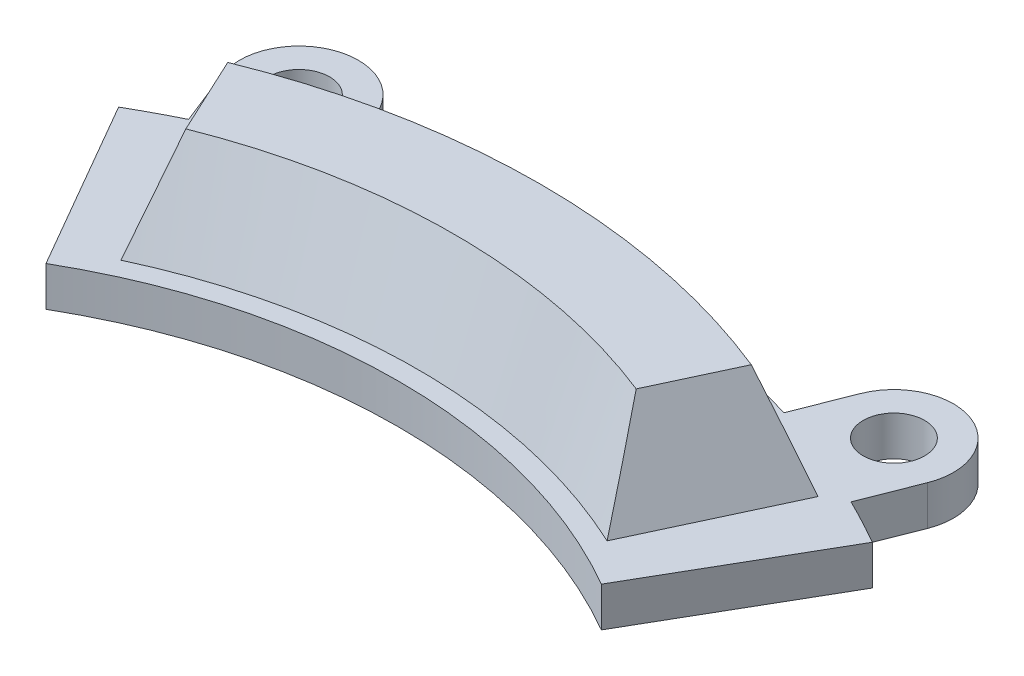
ISO-10303-21;
HEADER;
FILE_DESCRIPTION(('STEP AP214'),'2;1');
FILE_NAME('part.step','',(''),(''),'','','');
FILE_SCHEMA(('AUTOMOTIVE_DESIGN { 1 0 10303 214 1 1 1 1 }'));
ENDSEC;
DATA;
#1=APPLICATION_CONTEXT('core data for automotive mechanical design processes');
#2=APPLICATION_PROTOCOL_DEFINITION('international standard','automotive_design',2000,#1);
#3=PRODUCT_CONTEXT('',#1,'mechanical');
#4=PRODUCT('Part','Part','',(#3));
#5=PRODUCT_RELATED_PRODUCT_CATEGORY('part','',(#4));
#6=PRODUCT_DEFINITION_FORMATION('','',#4);
#7=PRODUCT_DEFINITION_CONTEXT('part definition',#1,'design');
#8=PRODUCT_DEFINITION('design','',#6,#7);
#9=PRODUCT_DEFINITION_SHAPE('','',#8);
#10=(LENGTH_UNIT() NAMED_UNIT(*) SI_UNIT(.MILLI.,.METRE.));
#11=(NAMED_UNIT(*) PLANE_ANGLE_UNIT() SI_UNIT($,.RADIAN.));
#12=(NAMED_UNIT(*) SI_UNIT($,.STERADIAN.) SOLID_ANGLE_UNIT());
#13=UNCERTAINTY_MEASURE_WITH_UNIT(LENGTH_MEASURE(1.E-05),#10,'distance_accuracy_value','');
#14=(GEOMETRIC_REPRESENTATION_CONTEXT(3) GLOBAL_UNCERTAINTY_ASSIGNED_CONTEXT((#13)) GLOBAL_UNIT_ASSIGNED_CONTEXT((#10,
#11,#12)) REPRESENTATION_CONTEXT('',''));
#15=CARTESIAN_POINT('',(0.,0.,0.));
#16=DIRECTION('',(0.,0.,1.));
#17=DIRECTION('',(1.,0.,0.));
#18=AXIS2_PLACEMENT_3D('',#15,#16,#17);
#19=CARTESIAN_POINT('',(0.,2.,0.));
#20=DIRECTION('',(0.,1.,0.));
#21=DIRECTION('',(0.,0.,1.));
#22=AXIS2_PLACEMENT_3D('',#19,#20,#21);
#23=PLANE('',#22);
#24=CARTESIAN_POINT('',(15.,2.,-38.));
#25=DIRECTION('',(0.,1.,0.));
#26=DIRECTION('',(0.,0.,1.));
#27=AXIS2_PLACEMENT_3D('',#24,#25,#26);
#28=CIRCLE('',#27,1.55);
#29=CARTESIAN_POINT('',(15.,2.,-36.45));
#30=VERTEX_POINT('',#29);
#31=EDGE_CURVE('E181',#30,#30,#28,.T.);
#32=ORIENTED_EDGE('',*,*,#31,.F.);
#33=EDGE_LOOP('',(#32));
#34=FACE_BOUND('',#33,.T.);
#35=CARTESIAN_POINT('',(0.,2.,0.));
#36=DIRECTION('',(0.,1.,0.));
#37=DIRECTION('',(0.,0.,1.));
#38=AXIS2_PLACEMENT_3D('',#35,#36,#37);
#39=CIRCLE('',#38,38.);
#40=CARTESIAN_POINT('',(-16.6992457747787,2.,-34.1340766764466));
#41=VERTEX_POINT('',#40);
#42=CARTESIAN_POINT('',(-19.0000000000002,2.,-32.9089653438086));
#43=VERTEX_POINT('',#42);
#44=EDGE_CURVE('E212',#41,#43,#39,.T.);
#45=ORIENTED_EDGE('',*,*,#44,.T.);
#46=DIRECTION('',(0.500000000000004,0.,0.866025403784436));
#47=VECTOR('',#46,1.);
#48=CARTESIAN_POINT('',(-14.0000000000001,2.,-24.2487113059642));
#49=LINE('',#48,#47);
#50=CARTESIAN_POINT('',(-14.0000000000001,2.,-24.2487113059642));
#51=VERTEX_POINT('',#50);
#52=EDGE_CURVE('E117',#43,#51,#49,.T.);
#53=ORIENTED_EDGE('',*,*,#52,.T.);
#54=CARTESIAN_POINT('',(0.,2.,0.));
#55=DIRECTION('',(0.,-1.,0.));
#56=DIRECTION('',(0.,0.,1.));
#57=AXIS2_PLACEMENT_3D('',#54,#55,#56);
#58=CIRCLE('',#57,28.);
#59=CARTESIAN_POINT('',(13.9999999999999,2.,-24.2487113059643));
#60=VERTEX_POINT('',#59);
#61=EDGE_CURVE('E249',#51,#60,#58,.T.);
#62=ORIENTED_EDGE('',*,*,#61,.T.);
#63=DIRECTION('',(0.499999999999998,0.,-0.86602540378444));
#64=VECTOR('',#63,1.);
#65=CARTESIAN_POINT('',(13.9999999999999,2.,-24.2487113059643));
#66=LINE('',#65,#64);
#67=CARTESIAN_POINT('',(18.9999999999999,2.,-32.9089653438087));
#68=VERTEX_POINT('',#67);
#69=EDGE_CURVE('E269',#60,#68,#66,.T.);
#70=ORIENTED_EDGE('',*,*,#69,.T.);
#71=CARTESIAN_POINT('',(0.,2.,0.));
#72=DIRECTION('',(0.,1.,0.));
#73=DIRECTION('',(0.,0.,1.));
#74=AXIS2_PLACEMENT_3D('',#71,#72,#73);
#75=CIRCLE('',#74,38.);
#76=CARTESIAN_POINT('',(16.6992457747787,2.,-34.1340766764466));
#77=VERTEX_POINT('',#76);
#78=EDGE_CURVE('E265',#68,#77,#75,.T.);
#79=ORIENTED_EDGE('',*,*,#78,.T.);
#80=DIRECTION('',(0.367166534736049,0.,-0.930155221331322));
#81=VECTOR('',#80,1.);
#82=CARTESIAN_POINT('',(16.6992457747787,2.,-34.1340766764466));
#83=LINE('',#82,#81);
#84=CARTESIAN_POINT('',(17.790465663994,2.,-36.8985003957919));
#85=VERTEX_POINT('',#84);
#86=EDGE_CURVE('E268',#77,#85,#83,.T.);
#87=ORIENTED_EDGE('',*,*,#86,.T.);
#88=CARTESIAN_POINT('',(15.,2.,-38.));
#89=DIRECTION('',(0.,1.,0.));
#90=DIRECTION('',(0.,0.,1.));
#91=AXIS2_PLACEMENT_3D('',#88,#89,#90);
#92=CIRCLE('',#91,3.);
#93=CARTESIAN_POINT('',(12.209534336006,2.,-39.1014996042081));
#94=VERTEX_POINT('',#93);
#95=EDGE_CURVE('E273',#85,#94,#92,.T.);
#96=ORIENTED_EDGE('',*,*,#95,.T.);
#97=DIRECTION('',(-0.367166534736048,0.,0.930155221331323));
#98=VECTOR('',#97,1.);
#99=CARTESIAN_POINT('',(11.1183144467908,2.,-36.3370758848629));
#100=LINE('',#99,#98);
#101=CARTESIAN_POINT('',(11.1183144467908,2.,-36.3370758848629));
#102=VERTEX_POINT('',#101);
#103=EDGE_CURVE('E280',#94,#102,#100,.T.);
#104=ORIENTED_EDGE('',*,*,#103,.T.);
#105=CARTESIAN_POINT('',(0.,2.,0.));
#106=DIRECTION('',(0.,1.,0.));
#107=DIRECTION('',(0.,0.,1.));
#108=AXIS2_PLACEMENT_3D('',#105,#106,#107);
#109=CIRCLE('',#108,38.);
#110=CARTESIAN_POINT('',(-11.1183144467908,2.,-36.3370758848629));
#111=VERTEX_POINT('',#110);
#112=EDGE_CURVE('E151',#102,#111,#109,.T.);
#113=ORIENTED_EDGE('',*,*,#112,.T.);
#114=DIRECTION('',(-0.367166534736048,0.,-0.930155221331323));
#115=VECTOR('',#114,1.);
#116=CARTESIAN_POINT('',(-11.1183144467908,2.,-36.3370758848629));
#117=LINE('',#116,#115);
#118=CARTESIAN_POINT('',(-12.209534336006,2.,-39.1014996042081));
#119=VERTEX_POINT('',#118);
#120=EDGE_CURVE('E144',#111,#119,#117,.T.);
#121=ORIENTED_EDGE('',*,*,#120,.T.);
#122=CARTESIAN_POINT('',(-15.,2.,-38.));
#123=DIRECTION('',(0.,1.,0.));
#124=DIRECTION('',(0.,0.,1.));
#125=AXIS2_PLACEMENT_3D('',#122,#123,#124);
#126=CIRCLE('',#125,3.);
#127=CARTESIAN_POINT('',(-17.790465663994,2.,-36.8985003957918));
#128=VERTEX_POINT('',#127);
#129=EDGE_CURVE('E148',#119,#128,#126,.T.);
#130=ORIENTED_EDGE('',*,*,#129,.T.);
#131=DIRECTION('',(0.367166534736048,0.,0.930155221331323));
#132=VECTOR('',#131,1.);
#133=CARTESIAN_POINT('',(-16.6992457747787,2.,-34.1340766764466));
#134=LINE('',#133,#132);
#135=EDGE_CURVE('E64',#128,#41,#134,.T.);
#136=ORIENTED_EDGE('',*,*,#135,.T.);
#137=EDGE_LOOP('',(#45,#53,#62,#70,#79,#87,#96,#104,#113,#121,#130,#136));
#138=FACE_BOUND('',#137,.T.);
#139=CARTESIAN_POINT('',(-15.,2.,-38.));
#140=DIRECTION('',(0.,1.,0.));
#141=DIRECTION('',(0.,0.,1.));
#142=AXIS2_PLACEMENT_3D('',#139,#140,#141);
#143=CIRCLE('',#142,1.55);
#144=CARTESIAN_POINT('',(-15.,2.,-36.45));
#145=VERTEX_POINT('',#144);
#146=EDGE_CURVE('E307',#145,#145,#143,.T.);
#147=ORIENTED_EDGE('',*,*,#146,.F.);
#148=EDGE_LOOP('',(#147));
#149=FACE_BOUND('',#148,.T.);
#150=DIRECTION('',(0.422618261740697,0.,-0.906307787036651));
#151=VECTOR('',#150,1.);
#152=CARTESIAN_POINT('',(12.2559295904802,2.,-26.2829258240629));
#153=LINE('',#152,#151);
#154=CARTESIAN_POINT('',(12.2559295904802,2.,-26.2829258240629));
#155=VERTEX_POINT('',#154);
#156=CARTESIAN_POINT('',(15.6368756844058,2.,-33.5333881203561));
#157=VERTEX_POINT('',#156);
#158=EDGE_CURVE('E572',#155,#157,#153,.T.);
#159=ORIENTED_EDGE('',*,*,#158,.F.);
#160=CARTESIAN_POINT('',(0.,2.,0.));
#161=DIRECTION('',(0.,-1.,0.));
#162=DIRECTION('',(0.,0.,1.));
#163=AXIS2_PLACEMENT_3D('',#160,#161,#162);
#164=CIRCLE('',#163,29.);
#165=CARTESIAN_POINT('',(-12.2559295904804,2.,-26.2829258240628));
#166=VERTEX_POINT('',#165);
#167=EDGE_CURVE('E561',#166,#155,#164,.T.);
#168=ORIENTED_EDGE('',*,*,#167,.F.);
#169=DIRECTION('',(0.422618261740704,0.,0.906307787036648));
#170=VECTOR('',#169,1.);
#171=CARTESIAN_POINT('',(-12.2559295904804,2.,-26.2829258240628));
#172=LINE('',#171,#170);
#173=CARTESIAN_POINT('',(-15.636875684406,2.,-33.533388120356));
#174=VERTEX_POINT('',#173);
#175=EDGE_CURVE('E336',#174,#166,#172,.T.);
#176=ORIENTED_EDGE('',*,*,#175,.F.);
#177=CARTESIAN_POINT('',(0.,2.,0.));
#178=DIRECTION('',(0.,1.,0.));
#179=DIRECTION('',(0.,0.,1.));
#180=AXIS2_PLACEMENT_3D('',#177,#178,#179);
#181=CIRCLE('',#180,37.);
#182=EDGE_CURVE('E576',#157,#174,#181,.T.);
#183=ORIENTED_EDGE('',*,*,#182,.F.);
#184=EDGE_LOOP('',(#159,#168,#176,#183));
#185=FACE_BOUND('',#184,.T.);
#186=ADVANCED_FACE('F39',(#34,#138,#149,#185),#23,.T.);
#187=CARTESIAN_POINT('',(0.,0.,0.));
#188=DIRECTION('',(0.,1.,0.));
#189=DIRECTION('',(0.,0.,1.));
#190=AXIS2_PLACEMENT_3D('',#187,#188,#189);
#191=PLANE('',#190);
#192=CARTESIAN_POINT('',(0.,0.,0.));
#193=DIRECTION('',(0.,1.,0.));
#194=DIRECTION('',(0.,0.,1.));
#195=AXIS2_PLACEMENT_3D('',#192,#193,#194);
#196=CIRCLE('',#195,38.);
#197=CARTESIAN_POINT('',(-16.6992457747787,0.,-34.1340766764466));
#198=VERTEX_POINT('',#197);
#199=CARTESIAN_POINT('',(-19.0000000000002,0.,-32.9089653438086));
#200=VERTEX_POINT('',#199);
#201=EDGE_CURVE('E176',#198,#200,#196,.T.);
#202=ORIENTED_EDGE('',*,*,#201,.F.);
#203=DIRECTION('',(0.367166534736048,0.,0.930155221331323));
#204=VECTOR('',#203,1.);
#205=CARTESIAN_POINT('',(-16.6992457747787,0.,-34.1340766764466));
#206=LINE('',#205,#204);
#207=CARTESIAN_POINT('',(-17.790465663994,0.,-36.8985003957918));
#208=VERTEX_POINT('',#207);
#209=EDGE_CURVE('E109',#208,#198,#206,.T.);
#210=ORIENTED_EDGE('',*,*,#209,.F.);
#211=CARTESIAN_POINT('',(-15.,0.,-38.));
#212=DIRECTION('',(0.,1.,0.));
#213=DIRECTION('',(0.,0.,1.));
#214=AXIS2_PLACEMENT_3D('',#211,#212,#213);
#215=CIRCLE('',#214,3.);
#216=CARTESIAN_POINT('',(-12.209534336006,0.,-39.1014996042081));
#217=VERTEX_POINT('',#216);
#218=EDGE_CURVE('E207',#217,#208,#215,.T.);
#219=ORIENTED_EDGE('',*,*,#218,.F.);
#220=DIRECTION('',(-0.367166534736048,0.,-0.930155221331323));
#221=VECTOR('',#220,1.);
#222=CARTESIAN_POINT('',(-11.1183144467908,0.,-36.3370758848629));
#223=LINE('',#222,#221);
#224=CARTESIAN_POINT('',(-11.1183144467908,0.,-36.3370758848629));
#225=VERTEX_POINT('',#224);
#226=EDGE_CURVE('E161',#225,#217,#223,.T.);
#227=ORIENTED_EDGE('',*,*,#226,.F.);
#228=CARTESIAN_POINT('',(0.,0.,0.));
#229=DIRECTION('',(0.,1.,0.));
#230=DIRECTION('',(0.,0.,1.));
#231=AXIS2_PLACEMENT_3D('',#228,#229,#230);
#232=CIRCLE('',#231,38.);
#233=CARTESIAN_POINT('',(11.1183144467908,0.,-36.3370758848629));
#234=VERTEX_POINT('',#233);
#235=EDGE_CURVE('E202',#234,#225,#232,.T.);
#236=ORIENTED_EDGE('',*,*,#235,.F.);
#237=DIRECTION('',(-0.367166534736048,0.,0.930155221331323));
#238=VECTOR('',#237,1.);
#239=CARTESIAN_POINT('',(11.1183144467908,0.,-36.3370758848629));
#240=LINE('',#239,#238);
#241=CARTESIAN_POINT('',(12.209534336006,0.,-39.1014996042081));
#242=VERTEX_POINT('',#241);
#243=EDGE_CURVE('E199',#242,#234,#240,.T.);
#244=ORIENTED_EDGE('',*,*,#243,.F.);
#245=CARTESIAN_POINT('',(15.,0.,-38.));
#246=DIRECTION('',(0.,1.,0.));
#247=DIRECTION('',(0.,0.,1.));
#248=AXIS2_PLACEMENT_3D('',#245,#246,#247);
#249=CIRCLE('',#248,3.);
#250=CARTESIAN_POINT('',(17.790465663994,0.,-36.8985003957919));
#251=VERTEX_POINT('',#250);
#252=EDGE_CURVE('E196',#251,#242,#249,.T.);
#253=ORIENTED_EDGE('',*,*,#252,.F.);
#254=DIRECTION('',(0.367166534736049,0.,-0.930155221331322));
#255=VECTOR('',#254,1.);
#256=CARTESIAN_POINT('',(16.6992457747787,0.,-34.1340766764466));
#257=LINE('',#256,#255);
#258=CARTESIAN_POINT('',(16.6992457747787,0.,-34.1340766764466));
#259=VERTEX_POINT('',#258);
#260=EDGE_CURVE('E193',#259,#251,#257,.T.);
#261=ORIENTED_EDGE('',*,*,#260,.F.);
#262=CARTESIAN_POINT('',(0.,0.,0.));
#263=DIRECTION('',(0.,1.,0.));
#264=DIRECTION('',(0.,0.,1.));
#265=AXIS2_PLACEMENT_3D('',#262,#263,#264);
#266=CIRCLE('',#265,38.);
#267=CARTESIAN_POINT('',(18.9999999999999,0.,-32.9089653438087));
#268=VERTEX_POINT('',#267);
#269=EDGE_CURVE('E190',#268,#259,#266,.T.);
#270=ORIENTED_EDGE('',*,*,#269,.F.);
#271=DIRECTION('',(0.499999999999998,0.,-0.86602540378444));
#272=VECTOR('',#271,1.);
#273=CARTESIAN_POINT('',(13.9999999999999,0.,-24.2487113059643));
#274=LINE('',#273,#272);
#275=CARTESIAN_POINT('',(13.9999999999999,0.,-24.2487113059643));
#276=VERTEX_POINT('',#275);
#277=EDGE_CURVE('E187',#276,#268,#274,.T.);
#278=ORIENTED_EDGE('',*,*,#277,.F.);
#279=CARTESIAN_POINT('',(0.,0.,0.));
#280=DIRECTION('',(0.,-1.,0.));
#281=DIRECTION('',(0.,0.,1.));
#282=AXIS2_PLACEMENT_3D('',#279,#280,#281);
#283=CIRCLE('',#282,28.);
#284=CARTESIAN_POINT('',(-14.0000000000001,0.,-24.2487113059642));
#285=VERTEX_POINT('',#284);
#286=EDGE_CURVE('E184',#285,#276,#283,.T.);
#287=ORIENTED_EDGE('',*,*,#286,.F.);
#288=DIRECTION('',(0.500000000000004,0.,0.866025403784436));
#289=VECTOR('',#288,1.);
#290=CARTESIAN_POINT('',(-14.0000000000001,0.,-24.2487113059642));
#291=LINE('',#290,#289);
#292=EDGE_CURVE('E180',#200,#285,#291,.T.);
#293=ORIENTED_EDGE('',*,*,#292,.F.);
#294=EDGE_LOOP('',(#202,#210,#219,#227,#236,#244,#253,#261,#270,#278,#287,#293));
#295=FACE_BOUND('',#294,.T.);
#296=CARTESIAN_POINT('',(15.,0.,-38.));
#297=DIRECTION('',(0.,1.,0.));
#298=DIRECTION('',(0.,0.,1.));
#299=AXIS2_PLACEMENT_3D('',#296,#297,#298);
#300=CIRCLE('',#299,1.55);
#301=CARTESIAN_POINT('',(15.,0.,-36.45));
#302=VERTEX_POINT('',#301);
#303=EDGE_CURVE('E302',#302,#302,#300,.T.);
#304=ORIENTED_EDGE('',*,*,#303,.T.);
#305=EDGE_LOOP('',(#304));
#306=FACE_BOUND('',#305,.T.);
#307=CARTESIAN_POINT('',(-15.,0.,-38.));
#308=DIRECTION('',(0.,1.,0.));
#309=DIRECTION('',(0.,0.,1.));
#310=AXIS2_PLACEMENT_3D('',#307,#308,#309);
#311=CIRCLE('',#310,1.55);
#312=CARTESIAN_POINT('',(-15.,0.,-36.45));
#313=VERTEX_POINT('',#312);
#314=EDGE_CURVE('E311',#313,#313,#311,.T.);
#315=ORIENTED_EDGE('',*,*,#314,.T.);
#316=EDGE_LOOP('',(#315));
#317=FACE_BOUND('',#316,.T.);
#318=ADVANCED_FACE('F253',(#295,#306,#317),#191,.F.);
#319=CARTESIAN_POINT('',(0.,2.,0.));
#320=DIRECTION('',(0.,-1.,0.));
#321=DIRECTION('',(0.,0.,-1.));
#322=AXIS2_PLACEMENT_3D('',#319,#320,#321);
#323=CYLINDRICAL_SURFACE('',#322,38.);
#324=ORIENTED_EDGE('',*,*,#201,.T.);
#325=DIRECTION('',(0.,-1.,0.));
#326=VECTOR('',#325,1.);
#327=CARTESIAN_POINT('',(-19.0000000000002,2.,-32.9089653438086));
#328=LINE('',#327,#326);
#329=EDGE_CURVE('E11',#43,#200,#328,.T.);
#330=ORIENTED_EDGE('',*,*,#329,.F.);
#331=ORIENTED_EDGE('',*,*,#44,.F.);
#332=DIRECTION('',(0.,-1.,0.));
#333=VECTOR('',#332,1.);
#334=CARTESIAN_POINT('',(-16.6992457747787,2.,-34.1340766764466));
#335=LINE('',#334,#333);
#336=EDGE_CURVE('E172',#41,#198,#335,.T.);
#337=ORIENTED_EDGE('',*,*,#336,.T.);
#338=EDGE_LOOP('',(#324,#330,#331,#337));
#339=FACE_BOUND('',#338,.T.);
#340=ADVANCED_FACE('F41',(#339),#323,.T.);
#341=CARTESIAN_POINT('',(-14.0000000000001,2.,-24.2487113059642));
#342=DIRECTION('',(0.866025403784436,0.,-0.500000000000004));
#343=DIRECTION('',(-0.500000000000004,0.,-0.866025403784436));
#344=AXIS2_PLACEMENT_3D('',#341,#342,#343);
#345=PLANE('',#344);
#346=ORIENTED_EDGE('',*,*,#292,.T.);
#347=DIRECTION('',(0.,-1.,0.));
#348=VECTOR('',#347,1.);
#349=CARTESIAN_POINT('',(-14.0000000000001,2.,-24.2487113059642));
#350=LINE('',#349,#348);
#351=EDGE_CURVE('E48',#51,#285,#350,.T.);
#352=ORIENTED_EDGE('',*,*,#351,.F.);
#353=ORIENTED_EDGE('',*,*,#52,.F.);
#354=ORIENTED_EDGE('',*,*,#329,.T.);
#355=EDGE_LOOP('',(#346,#352,#353,#354));
#356=FACE_BOUND('',#355,.T.);
#357=ADVANCED_FACE('F425',(#356),#345,.F.);
#358=CARTESIAN_POINT('',(0.,2.,0.));
#359=DIRECTION('',(0.,-1.,0.));
#360=DIRECTION('',(0.,0.,-1.));
#361=AXIS2_PLACEMENT_3D('',#358,#359,#360);
#362=CYLINDRICAL_SURFACE('',#361,28.);
#363=ORIENTED_EDGE('',*,*,#286,.T.);
#364=DIRECTION('',(0.,-1.,0.));
#365=VECTOR('',#364,1.);
#366=CARTESIAN_POINT('',(13.9999999999999,2.,-24.2487113059643));
#367=LINE('',#366,#365);
#368=EDGE_CURVE('E239',#60,#276,#367,.T.);
#369=ORIENTED_EDGE('',*,*,#368,.F.);
#370=ORIENTED_EDGE('',*,*,#61,.F.);
#371=ORIENTED_EDGE('',*,*,#351,.T.);
#372=EDGE_LOOP('',(#363,#369,#370,#371));
#373=FACE_BOUND('',#372,.T.);
#374=ADVANCED_FACE('F247',(#373),#362,.F.);
#375=CARTESIAN_POINT('',(13.9999999999999,2.,-24.2487113059643));
#376=DIRECTION('',(-0.86602540378444,0.,-0.499999999999998));
#377=DIRECTION('',(-0.499999999999998,0.,0.86602540378444));
#378=AXIS2_PLACEMENT_3D('',#375,#376,#377);
#379=PLANE('',#378);
#380=ORIENTED_EDGE('',*,*,#277,.T.);
#381=DIRECTION('',(0.,-1.,0.));
#382=VECTOR('',#381,1.);
#383=CARTESIAN_POINT('',(18.9999999999999,2.,-32.9089653438087));
#384=LINE('',#383,#382);
#385=EDGE_CURVE('E235',#68,#268,#384,.T.);
#386=ORIENTED_EDGE('',*,*,#385,.F.);
#387=ORIENTED_EDGE('',*,*,#69,.F.);
#388=ORIENTED_EDGE('',*,*,#368,.T.);
#389=EDGE_LOOP('',(#380,#386,#387,#388));
#390=FACE_BOUND('',#389,.T.);
#391=ADVANCED_FACE('F259',(#390),#379,.F.);
#392=CARTESIAN_POINT('',(0.,2.,0.));
#393=DIRECTION('',(0.,-1.,0.));
#394=DIRECTION('',(0.,0.,-1.));
#395=AXIS2_PLACEMENT_3D('',#392,#393,#394);
#396=CYLINDRICAL_SURFACE('',#395,38.);
#397=ORIENTED_EDGE('',*,*,#269,.T.);
#398=DIRECTION('',(0.,-1.,0.));
#399=VECTOR('',#398,1.);
#400=CARTESIAN_POINT('',(16.6992457747787,2.,-34.1340766764466));
#401=LINE('',#400,#399);
#402=EDGE_CURVE('E231',#77,#259,#401,.T.);
#403=ORIENTED_EDGE('',*,*,#402,.F.);
#404=ORIENTED_EDGE('',*,*,#78,.F.);
#405=ORIENTED_EDGE('',*,*,#385,.T.);
#406=EDGE_LOOP('',(#397,#403,#404,#405));
#407=FACE_BOUND('',#406,.T.);
#408=ADVANCED_FACE('F263',(#407),#396,.T.);
#409=CARTESIAN_POINT('',(16.6992457747787,2.,-34.1340766764466));
#410=DIRECTION('',(-0.930155221331323,0.,-0.367166534736049));
#411=DIRECTION('',(-0.367166534736049,0.,0.930155221331323));
#412=AXIS2_PLACEMENT_3D('',#409,#410,#411);
#413=PLANE('',#412);
#414=ORIENTED_EDGE('',*,*,#260,.T.);
#415=DIRECTION('',(0.,-1.,0.));
#416=VECTOR('',#415,1.);
#417=CARTESIAN_POINT('',(17.790465663994,2.,-36.8985003957919));
#418=LINE('',#417,#416);
#419=EDGE_CURVE('E227',#85,#251,#418,.T.);
#420=ORIENTED_EDGE('',*,*,#419,.F.);
#421=ORIENTED_EDGE('',*,*,#86,.F.);
#422=ORIENTED_EDGE('',*,*,#402,.T.);
#423=EDGE_LOOP('',(#414,#420,#421,#422));
#424=FACE_BOUND('',#423,.T.);
#425=ADVANCED_FACE('F415',(#424),#413,.F.);
#426=CARTESIAN_POINT('',(15.,2.,-38.));
#427=DIRECTION('',(0.,-1.,0.));
#428=DIRECTION('',(0.,0.,-1.));
#429=AXIS2_PLACEMENT_3D('',#426,#427,#428);
#430=CYLINDRICAL_SURFACE('',#429,3.);
#431=ORIENTED_EDGE('',*,*,#252,.T.);
#432=DIRECTION('',(0.,-1.,0.));
#433=VECTOR('',#432,1.);
#434=CARTESIAN_POINT('',(12.209534336006,2.,-39.1014996042081));
#435=LINE('',#434,#433);
#436=EDGE_CURVE('E223',#94,#242,#435,.T.);
#437=ORIENTED_EDGE('',*,*,#436,.F.);
#438=ORIENTED_EDGE('',*,*,#95,.F.);
#439=ORIENTED_EDGE('',*,*,#419,.T.);
#440=EDGE_LOOP('',(#431,#437,#438,#439));
#441=FACE_BOUND('',#440,.T.);
#442=ADVANCED_FACE('F412',(#441),#430,.T.);
#443=CARTESIAN_POINT('',(11.1183144467908,2.,-36.3370758848629));
#444=DIRECTION('',(0.930155221331323,0.,0.367166534736048));
#445=DIRECTION('',(0.367166534736048,0.,-0.930155221331323));
#446=AXIS2_PLACEMENT_3D('',#443,#444,#445);
#447=PLANE('',#446);
#448=ORIENTED_EDGE('',*,*,#243,.T.);
#449=DIRECTION('',(0.,-1.,0.));
#450=VECTOR('',#449,1.);
#451=CARTESIAN_POINT('',(11.1183144467908,2.,-36.3370758848629));
#452=LINE('',#451,#450);
#453=EDGE_CURVE('E219',#102,#234,#452,.T.);
#454=ORIENTED_EDGE('',*,*,#453,.F.);
#455=ORIENTED_EDGE('',*,*,#103,.F.);
#456=ORIENTED_EDGE('',*,*,#436,.T.);
#457=EDGE_LOOP('',(#448,#454,#455,#456));
#458=FACE_BOUND('',#457,.T.);
#459=ADVANCED_FACE('F288',(#458),#447,.F.);
#460=CARTESIAN_POINT('',(0.,2.,0.));
#461=DIRECTION('',(0.,-1.,0.));
#462=DIRECTION('',(0.,0.,-1.));
#463=AXIS2_PLACEMENT_3D('',#460,#461,#462);
#464=CYLINDRICAL_SURFACE('',#463,38.);
#465=ORIENTED_EDGE('',*,*,#235,.T.);
#466=DIRECTION('',(0.,-1.,0.));
#467=VECTOR('',#466,1.);
#468=CARTESIAN_POINT('',(-11.1183144467908,2.,-36.3370758848629));
#469=LINE('',#468,#467);
#470=EDGE_CURVE('E165',#111,#225,#469,.T.);
#471=ORIENTED_EDGE('',*,*,#470,.F.);
#472=ORIENTED_EDGE('',*,*,#112,.F.);
#473=ORIENTED_EDGE('',*,*,#453,.T.);
#474=EDGE_LOOP('',(#465,#471,#472,#473));
#475=FACE_BOUND('',#474,.T.);
#476=ADVANCED_FACE('F292',(#475),#464,.T.);
#477=CARTESIAN_POINT('',(-11.1183144467908,2.,-36.3370758848629));
#478=DIRECTION('',(-0.930155221331323,0.,0.367166534736048));
#479=DIRECTION('',(0.367166534736048,0.,0.930155221331323));
#480=AXIS2_PLACEMENT_3D('',#477,#478,#479);
#481=PLANE('',#480);
#482=ORIENTED_EDGE('',*,*,#226,.T.);
#483=DIRECTION('',(0.,-1.,0.));
#484=VECTOR('',#483,1.);
#485=CARTESIAN_POINT('',(-12.209534336006,2.,-39.1014996042081));
#486=LINE('',#485,#484);
#487=EDGE_CURVE('E158',#119,#217,#486,.T.);
#488=ORIENTED_EDGE('',*,*,#487,.F.);
#489=ORIENTED_EDGE('',*,*,#120,.F.);
#490=ORIENTED_EDGE('',*,*,#470,.T.);
#491=EDGE_LOOP('',(#482,#488,#489,#490));
#492=FACE_BOUND('',#491,.T.);
#493=ADVANCED_FACE('F159',(#492),#481,.F.);
#494=CARTESIAN_POINT('',(-15.,2.,-38.));
#495=DIRECTION('',(0.,-1.,0.));
#496=DIRECTION('',(0.,0.,-1.));
#497=AXIS2_PLACEMENT_3D('',#494,#495,#496);
#498=CYLINDRICAL_SURFACE('',#497,3.);
#499=ORIENTED_EDGE('',*,*,#218,.T.);
#500=DIRECTION('',(0.,-1.,0.));
#501=VECTOR('',#500,1.);
#502=CARTESIAN_POINT('',(-17.790465663994,2.,-36.8985003957918));
#503=LINE('',#502,#501);
#504=EDGE_CURVE('E166',#128,#208,#503,.T.);
#505=ORIENTED_EDGE('',*,*,#504,.F.);
#506=ORIENTED_EDGE('',*,*,#129,.F.);
#507=ORIENTED_EDGE('',*,*,#487,.T.);
#508=EDGE_LOOP('',(#499,#505,#506,#507));
#509=FACE_BOUND('',#508,.T.);
#510=ADVANCED_FACE('F168',(#509),#498,.T.);
#511=CARTESIAN_POINT('',(-16.6992457747787,2.,-34.1340766764466));
#512=DIRECTION('',(0.930155221331323,0.,-0.367166534736048));
#513=DIRECTION('',(-0.367166534736048,0.,-0.930155221331323));
#514=AXIS2_PLACEMENT_3D('',#511,#512,#513);
#515=PLANE('',#514);
#516=ORIENTED_EDGE('',*,*,#209,.T.);
#517=ORIENTED_EDGE('',*,*,#336,.F.);
#518=ORIENTED_EDGE('',*,*,#135,.F.);
#519=ORIENTED_EDGE('',*,*,#504,.T.);
#520=EDGE_LOOP('',(#516,#517,#518,#519));
#521=FACE_BOUND('',#520,.T.);
#522=ADVANCED_FACE('F293',(#521),#515,.F.);
#523=CARTESIAN_POINT('',(15.,2.,-38.));
#524=DIRECTION('',(0.,-1.,0.));
#525=DIRECTION('',(0.,0.,-1.));
#526=AXIS2_PLACEMENT_3D('',#523,#524,#525);
#527=CYLINDRICAL_SURFACE('',#526,1.55);
#528=ORIENTED_EDGE('',*,*,#31,.T.);
#529=EDGE_LOOP('',(#528));
#530=FACE_BOUND('',#529,.T.);
#531=ORIENTED_EDGE('',*,*,#303,.F.);
#532=EDGE_LOOP('',(#531));
#533=FACE_BOUND('',#532,.T.);
#534=ADVANCED_FACE('F400',(#530,#533),#527,.F.);
#535=CARTESIAN_POINT('',(-15.,2.,-38.));
#536=DIRECTION('',(0.,-1.,0.));
#537=DIRECTION('',(0.,0.,-1.));
#538=AXIS2_PLACEMENT_3D('',#535,#536,#537);
#539=CYLINDRICAL_SURFACE('',#538,1.55);
#540=ORIENTED_EDGE('',*,*,#146,.T.);
#541=EDGE_LOOP('',(#540));
#542=FACE_BOUND('',#541,.T.);
#543=ORIENTED_EDGE('',*,*,#314,.F.);
#544=EDGE_LOOP('',(#543));
#545=FACE_BOUND('',#544,.T.);
#546=ADVANCED_FACE('F502',(#542,#545),#539,.F.);
#547=CARTESIAN_POINT('',(0.,2.,0.));
#548=DIRECTION('',(0.,1.,0.));
#549=DIRECTION('',(0.,0.,1.));
#550=AXIS2_PLACEMENT_3D('',#547,#548,#549);
#551=CONICAL_SURFACE('',#550,29.,0.349065850398867);
#552=ORIENTED_EDGE('',*,*,#167,.T.);
#553=CARTESIAN_POINT('',(11.352959828871,7.,-28.6526356439863));
#554=CARTESIAN_POINT('',(11.4302109303846,6.5821499105554,-28.4584374099908));
#555=CARTESIAN_POINT('',(11.5069886001383,6.16457402183559,-28.263460047362));
#556=CARTESIAN_POINT('',(11.659555153694,5.33000939510872,-27.8718905338023));
#557=CARTESIAN_POINT('',(11.735344056758,4.91302064580524,-27.6752984144503));
#558=CARTESIAN_POINT('',(11.8858942906788,4.07965208330693,-27.2804349722208));
#559=CARTESIAN_POINT('',(11.9606556199155,3.66327227107311,-27.0821636466967));
#560=CARTESIAN_POINT('',(12.1091073581071,2.83114855129461,-26.6838720579453));
#561=CARTESIAN_POINT('',(12.1827977461384,2.41540465631583,-26.4838517606693));
#562=CARTESIAN_POINT('',(12.2559295904802,2.,-26.2829258240629));
#563=B_SPLINE_CURVE_WITH_KNOTS('',3,(#553,#554,#555,#556,#557,#558,#559,#560,#561,#562),
.UNSPECIFIED.,.F.,.F.,(4,2,2,2,4),(0.,1.40161089254119,2.8031944395412,4.20478019613413,
5.60639329961415),.UNSPECIFIED.);
#564=CARTESIAN_POINT('',(11.352959828871,7.,-28.6526356439863));
#565=VERTEX_POINT('',#564);
#566=EDGE_CURVE('E315',#565,#155,#563,.T.);
#567=ORIENTED_EDGE('',*,*,#566,.F.);
#568=CARTESIAN_POINT('',(0.,7.,0.));
#569=DIRECTION('',(0.,1.,0.));
#570=DIRECTION('',(0.,0.,1.));
#571=AXIS2_PLACEMENT_3D('',#568,#569,#570);
#572=CIRCLE('',#571,30.819851171331);
#573=CARTESIAN_POINT('',(-11.3529598288712,7.,-28.6526356439862));
#574=VERTEX_POINT('',#573);
#575=EDGE_CURVE('E332',#574,#565,#572,.F.);
#576=ORIENTED_EDGE('',*,*,#575,.F.);
#577=CARTESIAN_POINT('',(-11.3529598288712,7.,-28.6526356439862));
#578=CARTESIAN_POINT('',(-11.4302109303849,6.5821499105554,-28.4584374099908));
#579=CARTESIAN_POINT('',(-11.5069886001386,6.16457402183559,-28.263460047362));
#580=CARTESIAN_POINT('',(-11.6595551536942,5.33000939510871,-27.8718905338022));
#581=CARTESIAN_POINT('',(-11.7353440567582,4.91302064580524,-27.6752984144502));
#582=CARTESIAN_POINT('',(-11.885894290679,4.07965208330693,-27.2804349722207));
#583=CARTESIAN_POINT('',(-11.9606556199157,3.66327227107311,-27.0821636466966));
#584=CARTESIAN_POINT('',(-12.1091073581073,2.83114855129461,-26.6838720579452));
#585=CARTESIAN_POINT('',(-12.1827977461386,2.41540465631583,-26.4838517606692));
#586=CARTESIAN_POINT('',(-12.2559295904804,2.,-26.2829258240628));
#587=B_SPLINE_CURVE_WITH_KNOTS('',3,(#577,#578,#579,#580,#581,#582,#583,#584,#585,#586),
.UNSPECIFIED.,.F.,.F.,(4,2,2,2,4),(0.,1.40161089254119,2.8031944395412,4.20478019613413,
5.60639329961415),.UNSPECIFIED.);
#588=EDGE_CURVE('E323',#574,#166,#587,.T.);
#589=ORIENTED_EDGE('',*,*,#588,.T.);
#590=EDGE_LOOP('',(#552,#567,#576,#589));
#591=FACE_BOUND('',#590,.T.);
#592=ADVANCED_FACE('F361',(#591),#551,.F.);
#593=CARTESIAN_POINT('',(12.2559295904802,2.,-26.2829258240629));
#594=DIRECTION('',(0.851650739639147,0.342020143325669,0.3971312619671));
#595=DIRECTION('',(0.422618261740697,0.,-0.906307787036651));
#596=AXIS2_PLACEMENT_3D('',#593,#594,#595);
#597=PLANE('',#596);
#598=ORIENTED_EDGE('',*,*,#158,.T.);
#599=CARTESIAN_POINT('',(13.1985220961902,7.,-32.6104566984837));
#600=CARTESIAN_POINT('',(13.402866948607,6.58454903512535,-32.6908780835766));
#601=CARTESIAN_POINT('',(13.6069140355713,6.16877438170897,-32.7703821393018));
#602=CARTESIAN_POINT('',(14.0144260263612,5.33661312151177,-32.9276147242563));
#603=CARTESIAN_POINT('',(14.2178909396475,4.92022652484374,-33.0053432824835));
#604=CARTESIAN_POINT('',(14.6242583845124,4.08686368088397,-33.1590865444684));
#605=CARTESIAN_POINT('',(14.827160916713,3.66988743424524,-33.2351012501226));
#606=CARTESIAN_POINT('',(15.2324227059152,2.83536386711763,-33.38547377982));
#607=CARTESIAN_POINT('',(15.4347819539835,2.41781653740668,-33.4598315767634));
#608=CARTESIAN_POINT('',(15.6368756844058,2.,-33.5333881203561));
#609=B_SPLINE_CURVE_WITH_KNOTS('',3,(#599,#600,#601,#602,#603,#604,#605,#606,#607,#608),
.UNSPECIFIED.,.F.,.F.,(4,2,2,2,4),(0.,1.40975563739738,2.81948823386623,4.22921927037579,
5.63897334709168),.UNSPECIFIED.);
#610=CARTESIAN_POINT('',(13.1985220961902,7.,-32.6104566984837));
#611=VERTEX_POINT('',#610);
#612=EDGE_CURVE('E337',#611,#157,#609,.T.);
#613=ORIENTED_EDGE('',*,*,#612,.F.);
#614=DIRECTION('',(-0.422618261740697,0.,0.906307787036651));
#615=VECTOR('',#614,1.);
#616=CARTESIAN_POINT('',(10.6065843026552,7.,-27.0520281627176));
#617=LINE('',#616,#615);
#618=EDGE_CURVE('E328',#565,#611,#617,.F.);
#619=ORIENTED_EDGE('',*,*,#618,.F.);
#620=ORIENTED_EDGE('',*,*,#566,.T.);
#621=EDGE_LOOP('',(#598,#613,#619,#620));
#622=FACE_BOUND('',#621,.T.);
#623=ADVANCED_FACE('F356',(#622),#597,.T.);
#624=CARTESIAN_POINT('',(0.,2.,0.));
#625=DIRECTION('',(0.,-1.,0.));
#626=DIRECTION('',(0.,0.,1.));
#627=AXIS2_PLACEMENT_3D('',#624,#625,#626);
#628=CONICAL_SURFACE('',#627,37.,0.349065850398867);
#629=ORIENTED_EDGE('',*,*,#182,.T.);
#630=CARTESIAN_POINT('',(-13.1985220961904,7.,-32.6104566984836));
#631=CARTESIAN_POINT('',(-13.4028669486073,6.58454903512535,-32.6908780835765));
#632=CARTESIAN_POINT('',(-13.6069140355715,6.16877438170897,-32.7703821393017));
#633=CARTESIAN_POINT('',(-14.0144260263615,5.33661312151177,-32.9276147242562));
#634=CARTESIAN_POINT('',(-14.2178909396478,4.92022652484374,-33.0053432824834));
#635=CARTESIAN_POINT('',(-14.6242583845126,4.08686368088397,-33.1590865444683));
#636=CARTESIAN_POINT('',(-14.8271609167132,3.66988743424524,-33.2351012501225));
#637=CARTESIAN_POINT('',(-15.2324227059155,2.83536386711763,-33.3854737798199));
#638=CARTESIAN_POINT('',(-15.4347819539838,2.41781653740668,-33.4598315767633));
#639=CARTESIAN_POINT('',(-15.636875684406,2.,-33.533388120356));
#640=B_SPLINE_CURVE_WITH_KNOTS('',3,(#630,#631,#632,#633,#634,#635,#636,#637,#638,#639),
.UNSPECIFIED.,.F.,.F.,(4,2,2,2,4),(0.,1.40975563739737,2.81948823386623,4.2292192703758,
5.63897334709168),.UNSPECIFIED.);
#641=CARTESIAN_POINT('',(-13.1985220961904,7.,-32.6104566984836));
#642=VERTEX_POINT('',#641);
#643=EDGE_CURVE('E55',#642,#174,#640,.T.);
#644=ORIENTED_EDGE('',*,*,#643,.F.);
#645=CARTESIAN_POINT('',(0.,7.,0.));
#646=DIRECTION('',(0.,1.,0.));
#647=DIRECTION('',(0.,0.,1.));
#648=AXIS2_PLACEMENT_3D('',#645,#646,#647);
#649=CIRCLE('',#648,35.180148828669);
#650=EDGE_CURVE('E324',#611,#642,#649,.T.);
#651=ORIENTED_EDGE('',*,*,#650,.F.);
#652=ORIENTED_EDGE('',*,*,#612,.T.);
#653=EDGE_LOOP('',(#629,#644,#651,#652));
#654=FACE_BOUND('',#653,.T.);
#655=ADVANCED_FACE('F353',(#654),#628,.T.);
#656=CARTESIAN_POINT('',(-12.2559295904804,2.,-26.2829258240628));
#657=DIRECTION('',(-0.851650739639144,0.342020143325669,0.397131261967107));
#658=DIRECTION('',(0.422618261740704,0.,0.906307787036648));
#659=AXIS2_PLACEMENT_3D('',#656,#657,#658);
#660=PLANE('',#659);
#661=ORIENTED_EDGE('',*,*,#175,.T.);
#662=ORIENTED_EDGE('',*,*,#588,.F.);
#663=DIRECTION('',(-0.422618261740704,0.,-0.906307787036648));
#664=VECTOR('',#663,1.);
#665=CARTESIAN_POINT('',(-10.6065843026554,7.,-27.0520281627175));
#666=LINE('',#665,#664);
#667=EDGE_CURVE('E319',#642,#574,#666,.F.);
#668=ORIENTED_EDGE('',*,*,#667,.F.);
#669=ORIENTED_EDGE('',*,*,#643,.T.);
#670=EDGE_LOOP('',(#661,#662,#668,#669));
#671=FACE_BOUND('',#670,.T.);
#672=ADVANCED_FACE('F381',(#671),#660,.T.);
#673=CARTESIAN_POINT('',(0.,7.,0.));
#674=DIRECTION('',(0.,1.,0.));
#675=DIRECTION('',(0.,0.,1.));
#676=AXIS2_PLACEMENT_3D('',#673,#674,#675);
#677=PLANE('',#676);
#678=ORIENTED_EDGE('',*,*,#575,.T.);
#679=ORIENTED_EDGE('',*,*,#618,.T.);
#680=ORIENTED_EDGE('',*,*,#650,.T.);
#681=ORIENTED_EDGE('',*,*,#667,.T.);
#682=EDGE_LOOP('',(#678,#679,#680,#681));
#683=FACE_BOUND('',#682,.T.);
#684=ADVANCED_FACE('F363',(#683),#677,.T.);
#685=CLOSED_SHELL('',(#186,#318,#340,#357,#374,#391,#408,#425,#442,#459,#476,#493,#510,#522,
#534,#546,#592,#623,#655,#672,#684));
#686=MANIFOLD_SOLID_BREP('B2',#685);
#687=ADVANCED_BREP_SHAPE_REPRESENTATION('',(#18,#686),#14);
#688=SHAPE_DEFINITION_REPRESENTATION(#9,#687);
ENDSEC;
END-ISO-10303-21;
